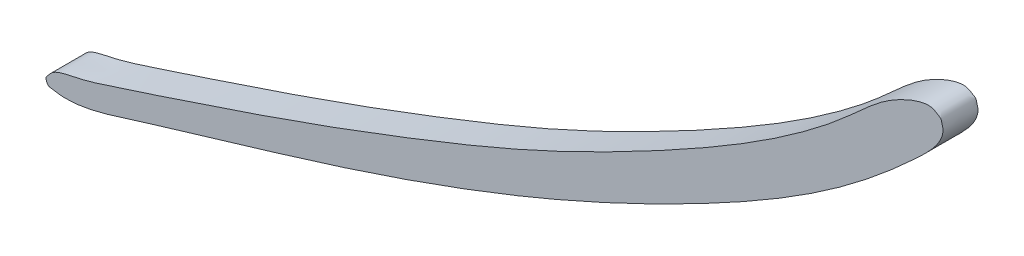
ISO-10303-21;
HEADER;
FILE_DESCRIPTION(('STEP AP214'),'2;1');
FILE_NAME('part.step','',(''),(''),'','','');
FILE_SCHEMA(('AUTOMOTIVE_DESIGN { 1 0 10303 214 1 1 1 1 }'));
ENDSEC;
DATA;
#1=APPLICATION_CONTEXT('core data for automotive mechanical design processes');
#2=APPLICATION_PROTOCOL_DEFINITION('international standard','automotive_design',2000,#1);
#3=PRODUCT_CONTEXT('',#1,'mechanical');
#4=PRODUCT('Part','Part','',(#3));
#5=PRODUCT_RELATED_PRODUCT_CATEGORY('part','',(#4));
#6=PRODUCT_DEFINITION_FORMATION('','',#4);
#7=PRODUCT_DEFINITION_CONTEXT('part definition',#1,'design');
#8=PRODUCT_DEFINITION('design','',#6,#7);
#9=PRODUCT_DEFINITION_SHAPE('','',#8);
#10=(LENGTH_UNIT() NAMED_UNIT(*) SI_UNIT(.MILLI.,.METRE.));
#11=(NAMED_UNIT(*) PLANE_ANGLE_UNIT() SI_UNIT($,.RADIAN.));
#12=(NAMED_UNIT(*) SI_UNIT($,.STERADIAN.) SOLID_ANGLE_UNIT());
#13=UNCERTAINTY_MEASURE_WITH_UNIT(LENGTH_MEASURE(1.E-05),#10,'distance_accuracy_value','');
#14=(GEOMETRIC_REPRESENTATION_CONTEXT(3) GLOBAL_UNCERTAINTY_ASSIGNED_CONTEXT((#13)) GLOBAL_UNIT_ASSIGNED_CONTEXT((#10,
#11,#12)) REPRESENTATION_CONTEXT('',''));
#15=CARTESIAN_POINT('',(0.,0.,0.));
#16=DIRECTION('',(0.,0.,1.));
#17=DIRECTION('',(1.,0.,0.));
#18=AXIS2_PLACEMENT_3D('',#15,#16,#17);
#19=CARTESIAN_POINT('',(101.278174761274,0.,164.));
#20=CARTESIAN_POINT('',(101.196611807845,0.13186931394045,164.));
#21=CARTESIAN_POINT('',(101.072466407993,0.224643944550873,164.));
#22=CARTESIAN_POINT('',(100.818565945272,0.395214220288657,164.));
#23=CARTESIAN_POINT('',(100.686543578852,0.472401149279883,164.));
#24=CARTESIAN_POINT('',(100.426362930768,0.632944433965708,164.));
#25=CARTESIAN_POINT('',(100.297634479578,0.715390452718156,164.));
#26=CARTESIAN_POINT('',(100.033903794659,0.870265721966218,164.));
#27=CARTESIAN_POINT('',(99.8993559470145,0.942916803534519,164.));
#28=CARTESIAN_POINT('',(99.6254353576749,1.07376517313045,164.));
#29=CARTESIAN_POINT('',(99.4856174166109,1.13169779454544,164.));
#30=CARTESIAN_POINT('',(99.1955989104292,1.22034410422208,164.));
#31=CARTESIAN_POINT('',(99.0444194431146,1.25209168169974,164.));
#32=CARTESIAN_POINT('',(98.5879754557925,1.31279358446028,164.));
#33=CARTESIAN_POINT('',(98.2843613202285,1.30831753406694,164.));
#34=CARTESIAN_POINT('',(97.6777965097938,1.2556339584156,164.));
#35=CARTESIAN_POINT('',(97.3744793383204,1.20594735266961,164.));
#36=CARTESIAN_POINT('',(96.7788856775683,1.08570169091296,164.));
#37=CARTESIAN_POINT('',(96.4848993358945,1.01389605244553,164.));
#38=CARTESIAN_POINT('',(95.6130694674906,0.767423543638094,164.));
#39=CARTESIAN_POINT('',(95.044443151236,0.564497070682965,164.));
#40=CARTESIAN_POINT('',(93.919150920644,0.121974005737695,164.));
#41=CARTESIAN_POINT('',(93.3617583737634,-0.121011476320135,164.));
#42=CARTESIAN_POINT('',(92.2673595765732,-0.639830667817924,164.));
#43=CARTESIAN_POINT('',(91.7307372745379,-0.914673392263955,164.));
#44=CARTESIAN_POINT('',(90.150529435972,-1.78247735530367,164.));
#45=CARTESIAN_POINT('',(89.1378841671863,-2.42058379336972,164.));
#46=CARTESIAN_POINT('',(86.2170336558303,-4.50574322574898,164.));
#47=CARTESIAN_POINT('',(84.4150847057242,-6.10798346029529,164.));
#48=CARTESIAN_POINT('',(81.7281867214623,-8.53412280786535,164.));
#49=CARTESIAN_POINT('',(80.8336850824739,-9.3444634949967,164.));
#50=CARTESIAN_POINT('',(79.02817022649,-10.941384270623,164.));
#51=CARTESIAN_POINT('',(78.1186309249775,-11.7300853625861,164.));
#52=CARTESIAN_POINT('',(75.3547056502068,-14.0453803963654,164.));
#53=CARTESIAN_POINT('',(73.4669744504147,-15.5239896728904,164.));
#54=CARTESIAN_POINT('',(69.6323568323243,-18.3960822977255,164.));
#55=CARTESIAN_POINT('',(67.6854942020713,-19.7895998776633,164.));
#56=CARTESIAN_POINT('',(63.7479241666334,-22.5135412436574,164.));
#57=CARTESIAN_POINT('',(61.7557712067038,-23.8418848380999,164.));
#58=CARTESIAN_POINT('',(57.7257896071502,-26.4328435125949,164.));
#59=CARTESIAN_POINT('',(55.6886841177962,-27.6964992250636,164.));
#60=CARTESIAN_POINT('',(51.5798184100099,-30.1739415758206,164.));
#61=CARTESIAN_POINT('',(49.5083162119315,-31.3880995122409,164.));
#62=CARTESIAN_POINT('',(45.3407776177159,-33.7811100234327,164.));
#63=CARTESIAN_POINT('',(43.2438648654855,-34.9597658724395,164.));
#64=CARTESIAN_POINT('',(36.924422148507,-38.4466613757849,164.));
#65=CARTESIAN_POINT('',(32.6752159295128,-40.7055268335579,164.));
#66=CARTESIAN_POINT('',(24.1213605227016,-45.112609571887,164.));
#67=CARTESIAN_POINT('',(19.8171065683248,-47.2605090621306,164.));
#68=CARTESIAN_POINT('',(11.135831427259,-51.4081389602946,164.));
#69=CARTESIAN_POINT('',(6.75573494709221,-53.4043805119669,164.));
#70=CARTESIAN_POINT('',(-2.06888960439692,-57.2382039481238,164.));
#71=CARTESIAN_POINT('',(-6.51387160351749,-59.0776823354614,164.));
#72=CARTESIAN_POINT('',(-15.4434151384645,-62.6628282345124,164.));
#73=CARTESIAN_POINT('',(-19.926244169031,-64.4117237709207,164.));
#74=CARTESIAN_POINT('',(-28.9124813953937,-67.8525832097907,164.));
#75=CARTESIAN_POINT('',(-33.4173433066344,-69.5422749724801,164.));
#76=CARTESIAN_POINT('',(-42.4553557897653,-72.8470309885117,164.));
#77=CARTESIAN_POINT('',(-46.9878439142653,-74.4609295085991,164.));
#78=CARTESIAN_POINT('',(-56.0779126718828,-77.6171084456401,164.));
#79=CARTESIAN_POINT('',(-60.6352005978237,-79.160458181162,164.));
#80=CARTESIAN_POINT('',(-69.7598956522185,-82.2169766430847,164.));
#81=CARTESIAN_POINT('',(-74.3266743966113,-83.7319960029322,164.));
#82=CARTESIAN_POINT('',(-81.1799698319193,-85.995013164245,164.));
#83=CARTESIAN_POINT('',(-83.4652954112106,-86.7466517405496,164.));
#84=CARTESIAN_POINT('',(-86.8968745676522,-87.8631101540163,164.));
#85=CARTESIAN_POINT('',(-88.041065650578,-88.2342324723788,164.));
#86=CARTESIAN_POINT('',(-90.3310455665826,-88.9715083774074,164.));
#87=CARTESIAN_POINT('',(-91.4782429255855,-89.3350921048735,164.));
#88=CARTESIAN_POINT('',(-93.7877967423607,-90.0027345821687,164.));
#89=CARTESIAN_POINT('',(-94.9503187192597,-90.3059988251538,164.));
#90=CARTESIAN_POINT('',(-96.7095494858666,-90.6999482276577,164.));
#91=CARTESIAN_POINT('',(-97.2995868202707,-90.8169546044106,164.));
#92=CARTESIAN_POINT('',(-98.4759188595069,-91.0657333364781,164.));
#93=CARTESIAN_POINT('',(-99.0611851569023,-91.1997371270738,164.));
#94=CARTESIAN_POINT('',(-100.208261835469,-91.5360754604389,164.));
#95=CARTESIAN_POINT('',(-100.771957271013,-91.7333202730694,164.));
#96=CARTESIAN_POINT('',(-101.432218296304,-92.1109093013032,164.));
#97=CARTESIAN_POINT('',(-101.562207175265,-92.1936417456148,164.));
#98=CARTESIAN_POINT('',(-101.808439941532,-92.3708284696113,164.));
#99=CARTESIAN_POINT('',(-101.925123839235,-92.4662940433738,164.));
#100=CARTESIAN_POINT('',(-102.259801648453,-92.7691156111485,164.));
#101=CARTESIAN_POINT('',(-102.463820143227,-92.9914023849305,164.));
#102=CARTESIAN_POINT('',(-102.754709358774,-93.3410059457333,164.));
#103=CARTESIAN_POINT('',(-102.852262442499,-93.4573877632831,164.));
#104=CARTESIAN_POINT('',(-103.036474174399,-93.6981103701269,164.));
#105=CARTESIAN_POINT('',(-103.127145808263,-93.8227457761735,164.));
#106=CARTESIAN_POINT('',(-103.210596798201,-94.0335270535309,164.));
#107=CARTESIAN_POINT('',(-103.227885265904,-94.1089993977839,164.));
#108=CARTESIAN_POINT('',(-103.234398813685,-94.2586320959487,164.));
#109=CARTESIAN_POINT('',(-103.225550827032,-94.3349698630311,164.));
#110=CARTESIAN_POINT('',(-103.177578170134,-94.555570855159,164.));
#111=CARTESIAN_POINT('',(-103.120697609588,-94.6943665734234,164.));
#112=CARTESIAN_POINT('',(-102.996451643543,-94.9684748467553,164.));
#113=CARTESIAN_POINT('',(-102.92905760982,-95.102758600488,164.));
#114=CARTESIAN_POINT('',(-102.795624236747,-95.2847701949518,164.));
#115=CARTESIAN_POINT('',(-102.744276828643,-95.3415284865059,164.));
#116=CARTESIAN_POINT('',(-102.628081009359,-95.4360199557578,164.));
#117=CARTESIAN_POINT('',(-102.561859248672,-95.4754600600116,164.));
#118=CARTESIAN_POINT('',(-102.352606948866,-95.5583360654393,164.));
#119=CARTESIAN_POINT('',(-102.199975238157,-95.5749744783614,164.));
#120=CARTESIAN_POINT('',(-101.899355797237,-95.6061832602794,164.));
#121=CARTESIAN_POINT('',(-101.748910655284,-95.6208018190503,164.));
#122=CARTESIAN_POINT('',(-101.299713583843,-95.6802319961183,164.));
#123=CARTESIAN_POINT('',(-101.001666873968,-95.730633150971,164.));
#124=CARTESIAN_POINT('',(-100.405129315416,-95.8262005599229,164.));
#125=CARTESIAN_POINT('',(-100.106806661241,-95.868542799422,164.));
#126=CARTESIAN_POINT('',(-99.2113880416712,-95.9500523185605,164.));
#127=CARTESIAN_POINT('',(-98.6139394940037,-95.9536081330314,164.));
#128=CARTESIAN_POINT('',(-96.8208402532593,-95.8881608033454,164.));
#129=CARTESIAN_POINT('',(-95.6205290670453,-95.752090895321,164.));
#130=CARTESIAN_POINT('',(-93.2604069109546,-95.3480764120028,164.));
#131=CARTESIAN_POINT('',(-92.0954694119324,-95.0783994068705,164.));
#132=CARTESIAN_POINT('',(-89.7794037715785,-94.4772560564484,164.));
#133=CARTESIAN_POINT('',(-88.6278281796122,-94.146487672298,164.));
#134=CARTESIAN_POINT('',(-85.1836472566121,-93.116248052865,164.));
#135=CARTESIAN_POINT('',(-82.8999233154662,-92.3888756297949,164.));
#136=CARTESIAN_POINT('',(-78.3251722413983,-90.9580177429241,164.));
#137=CARTESIAN_POINT('',(-76.0355134524054,-90.2498186162031,164.));
#138=CARTESIAN_POINT('',(-69.1565535010377,-88.1581877761038,164.));
#139=CARTESIAN_POINT('',(-64.5590753285306,-86.8018599396281,164.));
#140=CARTESIAN_POINT('',(-55.3686739116755,-84.0743221123157,164.));
#141=CARTESIAN_POINT('',(-50.7763054655863,-82.7014412654397,164.));
#142=CARTESIAN_POINT('',(-41.6124453177545,-79.8885150658556,164.));
#143=CARTESIAN_POINT('',(-37.0409962250183,-78.4483326317711,164.));
#144=CARTESIAN_POINT('',(-27.926595781695,-75.4762850406166,164.));
#145=CARTESIAN_POINT('',(-23.3841562030622,-73.9435444179661,164.));
#146=CARTESIAN_POINT('',(-14.339692815903,-70.7713915014889,164.));
#147=CARTESIAN_POINT('',(-9.83693004536124,-69.1317779937574,164.));
#148=CARTESIAN_POINT('',(-0.876191366635029,-65.7293928322584,164.));
#149=CARTESIAN_POINT('',(3.58276254816342,-63.9660064659851,164.));
#150=CARTESIAN_POINT('',(16.8713756248728,-58.4687874976129,164.));
#151=CARTESIAN_POINT('',(25.6160995295625,-54.5216087726302,164.));
#152=CARTESIAN_POINT('',(38.5432641440418,-48.2268448898704,164.));
#153=CARTESIAN_POINT('',(42.8155839669445,-46.0690258463445,164.));
#154=CARTESIAN_POINT('',(51.2782588030491,-41.6204850899157,164.));
#155=CARTESIAN_POINT('',(55.4685493784994,-39.3296588937684,164.));
#156=CARTESIAN_POINT('',(63.7316338621234,-34.5574903423925,164.));
#157=CARTESIAN_POINT('',(67.803252961178,-32.0742430810402,164.));
#158=CARTESIAN_POINT('',(73.7745419347511,-28.1286271365565,164.));
#159=CARTESIAN_POINT('',(75.7423620542375,-26.7767613571473,164.));
#160=CARTESIAN_POINT('',(79.6259654450552,-23.9886541247802,164.));
#161=CARTESIAN_POINT('',(81.5418670928573,-22.5526046145478,164.));
#162=CARTESIAN_POINT('',(85.319631451255,-19.5928836129997,164.));
#163=CARTESIAN_POINT('',(87.1809105576711,-18.0682658307868,164.));
#164=CARTESIAN_POINT('',(90.8521077991587,-14.9357505001002,164.));
#165=CARTESIAN_POINT('',(92.6598504157133,-13.3331954206633,164.));
#166=CARTESIAN_POINT('',(95.328327311143,-10.8842355465423,164.));
#167=CARTESIAN_POINT('',(96.210527941067,-10.0602407019361,164.));
#168=CARTESIAN_POINT('',(97.5062363595804,-8.79520605500653,164.));
#169=CARTESIAN_POINT('',(97.9325286638882,-8.36736814367718,164.));
#170=CARTESIAN_POINT('',(98.7641059423062,-7.49342435009831,164.));
#171=CARTESIAN_POINT('',(99.1707461053452,-7.04824060941403,164.));
#172=CARTESIAN_POINT('',(99.9427244250238,-6.12079967200792,164.));
#173=CARTESIAN_POINT('',(100.308787142155,-5.63687384755941,164.));
#174=CARTESIAN_POINT('',(100.954949199853,-4.6236742275265,164.));
#175=CARTESIAN_POINT('',(101.235050097085,-4.08999571632844,164.));
#176=CARTESIAN_POINT('',(101.551394168245,-3.23604652526543,164.));
#177=CARTESIAN_POINT('',(101.638230652332,-2.94732643231518,164.));
#178=CARTESIAN_POINT('',(101.721956094653,-2.50407029132432,164.));
#179=CARTESIAN_POINT('',(101.741958682091,-2.35458921743564,164.));
#180=CARTESIAN_POINT('',(101.760828733267,-2.05100479666709,164.));
#181=CARTESIAN_POINT('',(101.759638210253,-1.89652649367096,164.));
#182=CARTESIAN_POINT('',(101.711568032651,-1.44630210642924,164.));
#183=CARTESIAN_POINT('',(101.621432420505,-1.15746026935555,164.));
#184=CARTESIAN_POINT('',(101.493927991858,-0.722698804135184,164.));
#185=CARTESIAN_POINT('',(101.457853194145,-0.576132812227736,164.));
#186=CARTESIAN_POINT('',(101.388613050574,-0.281912743528655,164.));
#187=CARTESIAN_POINT('',(101.359737714703,-0.131869313940426,164.));
#188=CARTESIAN_POINT('',(101.278174761274,0.,164.));
#189=B_SPLINE_CURVE_WITH_KNOTS('',3,(#19,#20,#21,#22,#23,#24,#25,#26,#27,#28,#29,#30,#31,#32,
#33,#34,#35,#36,#37,#38,#39,#40,#41,#42,#43,#44,#45,#46,#47,#48,#49,#50,#51,#52,#53,#54,#55,#56,
#57,#58,#59,#60,#61,#62,#63,#64,#65,#66,#67,#68,#69,#70,#71,#72,#73,#74,#75,#76,#77,#78,#79,#80,
#81,#82,#83,#84,#85,#86,#87,#88,#89,#90,#91,#92,#93,#94,#95,#96,#97,#98,#99,#100,#101,#102,#103,
#104,#105,#106,#107,#108,#109,#110,#111,#112,#113,#114,#115,#116,#117,#118,#119,#120,#121,#122,
#123,#124,#125,#126,#127,#128,#129,#130,#131,#132,#133,#134,#135,#136,#137,#138,#139,#140,#141,
#142,#143,#144,#145,#146,#147,#148,#149,#150,#151,#152,#153,#154,#155,#156,#157,#158,#159,#160,
#161,#162,#163,#164,#165,#166,#167,#168,#169,#170,#171,#172,#173,#174,#175,#176,#177,#178,#179,
#180,#181,#182,#183,#184,#185,#186,#187,#188),.UNSPECIFIED.,.T.,.F.,(4,2,2,2,2,2,2,2,2,2,2,2,2,
2,2,2,2,2,2,2,2,2,2,2,2,2,2,2,2,2,2,2,2,2,2,2,2,2,2,2,2,2,2,2,2,2,2,2,2,2,2,2,2,2,2,2,2,2,2,2,2,
2,2,2,2,2,2,2,2,2,2,2,2,2,2,2,2,2,2,2,2,2,2,2,4),(0.,0.000976562500000054,0.00195312500000011,
0.00292968750000016,0.00390625000000022,0.00488281250000027,0.00585937500000033,
0.00781250000000035,0.00976562500000037,0.0117187500000004,0.0156250000000004,
0.0195312500000005,0.0234375000000005,0.0312500000000006,0.0468750000000008,0.0546875000000008,
0.0625000000000009,0.078125000000001,0.0937500000000011,0.109375000000001,0.125000000000001,
0.140625000000001,0.156250000000001,0.187500000000002,0.218750000000002,0.250000000000002,
0.281250000000002,0.312500000000002,0.343750000000002,0.375000000000003,0.406250000000003,
0.437500000000003,0.453125000000003,0.460937500000003,0.468750000000003,0.476562500000003,
0.480468750000003,0.484375000000003,0.488281250000003,0.489257812500003,0.490234375000003,
0.492187500000003,0.493164062500004,0.494140625000004,0.494628906250004,0.495117187500004,
0.496093750000004,0.497070312500004,0.497558593750004,0.498046875000004,0.499023437500004,
0.500000000000004,0.501953125000004,0.503906250000003,0.507812500000003,0.515625000000003,
0.523437500000003,0.531250000000003,0.546875000000003,0.562500000000003,0.593750000000003,
0.625000000000003,0.656250000000003,0.687500000000002,0.718750000000002,0.750000000000002,
0.812500000000002,0.843750000000001,0.875000000000001,0.906250000000001,0.921875000000001,
0.937500000000001,0.953125000000001,0.968750000000001,0.9765625,0.98046875,0.984375,0.98828125,
0.9921875,0.994140625,0.9951171875,0.99609375,0.998046875,0.9990234375,1.),.UNSPECIFIED.);
#190=DIRECTION('',(0.,0.,-1.));
#191=VECTOR('',#190,1.);
#192=SURFACE_OF_LINEAR_EXTRUSION('',#189,#191);
#193=CARTESIAN_POINT('',(101.278174761274,0.,164.));
#194=CARTESIAN_POINT('',(101.359737714703,-0.131869313940426,164.));
#195=CARTESIAN_POINT('',(101.388613050574,-0.281912743528655,164.));
#196=CARTESIAN_POINT('',(101.457853194145,-0.576132812227736,164.));
#197=CARTESIAN_POINT('',(101.493927991858,-0.722698804135184,164.));
#198=CARTESIAN_POINT('',(101.621432420505,-1.15746026935555,164.));
#199=CARTESIAN_POINT('',(101.711568032651,-1.44630210642924,164.));
#200=CARTESIAN_POINT('',(101.759638210253,-1.89652649367096,164.));
#201=CARTESIAN_POINT('',(101.760828733267,-2.05100479666709,164.));
#202=CARTESIAN_POINT('',(101.741958682091,-2.35458921743564,164.));
#203=CARTESIAN_POINT('',(101.721956094653,-2.50407029132432,164.));
#204=CARTESIAN_POINT('',(101.638230652332,-2.94732643231518,164.));
#205=CARTESIAN_POINT('',(101.551394168245,-3.23604652526543,164.));
#206=CARTESIAN_POINT('',(101.235050097085,-4.08999571632844,164.));
#207=CARTESIAN_POINT('',(100.954949199853,-4.6236742275265,164.));
#208=CARTESIAN_POINT('',(100.308787142155,-5.63687384755941,164.));
#209=CARTESIAN_POINT('',(99.9427244250238,-6.12079967200792,164.));
#210=CARTESIAN_POINT('',(99.1707461053452,-7.04824060941403,164.));
#211=CARTESIAN_POINT('',(98.7641059423062,-7.49342435009831,164.));
#212=CARTESIAN_POINT('',(97.9325286638882,-8.36736814367718,164.));
#213=CARTESIAN_POINT('',(97.5062363595804,-8.79520605500653,164.));
#214=CARTESIAN_POINT('',(96.210527941067,-10.0602407019361,164.));
#215=CARTESIAN_POINT('',(95.328327311143,-10.8842355465423,164.));
#216=CARTESIAN_POINT('',(92.6598504157133,-13.3331954206633,164.));
#217=CARTESIAN_POINT('',(90.8521077991587,-14.9357505001002,164.));
#218=CARTESIAN_POINT('',(87.1809105576711,-18.0682658307868,164.));
#219=CARTESIAN_POINT('',(85.319631451255,-19.5928836129997,164.));
#220=CARTESIAN_POINT('',(81.5418670928573,-22.5526046145478,164.));
#221=CARTESIAN_POINT('',(79.6259654450552,-23.9886541247802,164.));
#222=CARTESIAN_POINT('',(75.7423620542375,-26.7767613571473,164.));
#223=CARTESIAN_POINT('',(73.7745419347511,-28.1286271365565,164.));
#224=CARTESIAN_POINT('',(67.803252961178,-32.0742430810402,164.));
#225=CARTESIAN_POINT('',(63.7316338621234,-34.5574903423925,164.));
#226=CARTESIAN_POINT('',(55.4685493784994,-39.3296588937684,164.));
#227=CARTESIAN_POINT('',(51.2782588030491,-41.6204850899157,164.));
#228=CARTESIAN_POINT('',(42.8155839669445,-46.0690258463445,164.));
#229=CARTESIAN_POINT('',(38.5432641440418,-48.2268448898704,164.));
#230=CARTESIAN_POINT('',(25.6160995295625,-54.5216087726302,164.));
#231=CARTESIAN_POINT('',(16.8713756248728,-58.4687874976129,164.));
#232=CARTESIAN_POINT('',(3.58276254816342,-63.9660064659851,164.));
#233=CARTESIAN_POINT('',(-0.876191366635029,-65.7293928322584,164.));
#234=CARTESIAN_POINT('',(-9.83693004536124,-69.1317779937574,164.));
#235=CARTESIAN_POINT('',(-14.339692815903,-70.7713915014889,164.));
#236=CARTESIAN_POINT('',(-23.3841562030622,-73.9435444179661,164.));
#237=CARTESIAN_POINT('',(-27.926595781695,-75.4762850406166,164.));
#238=CARTESIAN_POINT('',(-37.0409962250183,-78.4483326317711,164.));
#239=CARTESIAN_POINT('',(-41.6124453177545,-79.8885150658556,164.));
#240=CARTESIAN_POINT('',(-50.7763054655863,-82.7014412654397,164.));
#241=CARTESIAN_POINT('',(-55.3686739116755,-84.0743221123157,164.));
#242=CARTESIAN_POINT('',(-64.5590753285306,-86.8018599396281,164.));
#243=CARTESIAN_POINT('',(-69.1565535010377,-88.1581877761038,164.));
#244=CARTESIAN_POINT('',(-76.0355134524054,-90.2498186162031,164.));
#245=CARTESIAN_POINT('',(-78.3251722413983,-90.9580177429241,164.));
#246=CARTESIAN_POINT('',(-82.8999233154662,-92.3888756297949,164.));
#247=CARTESIAN_POINT('',(-85.1836472566121,-93.116248052865,164.));
#248=CARTESIAN_POINT('',(-88.6278281796122,-94.146487672298,164.));
#249=CARTESIAN_POINT('',(-89.7794037715785,-94.4772560564484,164.));
#250=CARTESIAN_POINT('',(-92.0954694119324,-95.0783994068705,164.));
#251=CARTESIAN_POINT('',(-93.2604069109546,-95.3480764120028,164.));
#252=CARTESIAN_POINT('',(-95.6205290670453,-95.752090895321,164.));
#253=CARTESIAN_POINT('',(-96.8208402532593,-95.8881608033454,164.));
#254=CARTESIAN_POINT('',(-98.6139394940037,-95.9536081330314,164.));
#255=CARTESIAN_POINT('',(-99.2113880416712,-95.9500523185605,164.));
#256=CARTESIAN_POINT('',(-100.106806661241,-95.868542799422,164.));
#257=CARTESIAN_POINT('',(-100.405129315416,-95.8262005599229,164.));
#258=CARTESIAN_POINT('',(-101.001666873968,-95.730633150971,164.));
#259=CARTESIAN_POINT('',(-101.299713583843,-95.6802319961183,164.));
#260=CARTESIAN_POINT('',(-101.748910655284,-95.6208018190503,164.));
#261=CARTESIAN_POINT('',(-101.899355797237,-95.6061832602794,164.));
#262=CARTESIAN_POINT('',(-102.199975238157,-95.5749744783614,164.));
#263=CARTESIAN_POINT('',(-102.352606948866,-95.5583360654393,164.));
#264=CARTESIAN_POINT('',(-102.561859248672,-95.4754600600116,164.));
#265=CARTESIAN_POINT('',(-102.628081009359,-95.4360199557578,164.));
#266=CARTESIAN_POINT('',(-102.744276828643,-95.3415284865059,164.));
#267=CARTESIAN_POINT('',(-102.795624236747,-95.2847701949518,164.));
#268=CARTESIAN_POINT('',(-102.92905760982,-95.102758600488,164.));
#269=CARTESIAN_POINT('',(-102.996451643543,-94.9684748467553,164.));
#270=CARTESIAN_POINT('',(-103.120697609588,-94.6943665734234,164.));
#271=CARTESIAN_POINT('',(-103.177578170134,-94.555570855159,164.));
#272=CARTESIAN_POINT('',(-103.225550827032,-94.3349698630311,164.));
#273=CARTESIAN_POINT('',(-103.234398813685,-94.2586320959487,164.));
#274=CARTESIAN_POINT('',(-103.227885265904,-94.1089993977839,164.));
#275=CARTESIAN_POINT('',(-103.210596798201,-94.0335270535309,164.));
#276=CARTESIAN_POINT('',(-103.127145808263,-93.8227457761735,164.));
#277=CARTESIAN_POINT('',(-103.036474174399,-93.6981103701269,164.));
#278=CARTESIAN_POINT('',(-102.852262442499,-93.4573877632831,164.));
#279=CARTESIAN_POINT('',(-102.754709358774,-93.3410059457333,164.));
#280=CARTESIAN_POINT('',(-102.463820143227,-92.9914023849305,164.));
#281=CARTESIAN_POINT('',(-102.259801648453,-92.7691156111485,164.));
#282=CARTESIAN_POINT('',(-101.925123839235,-92.4662940433738,164.));
#283=CARTESIAN_POINT('',(-101.808439941532,-92.3708284696113,164.));
#284=CARTESIAN_POINT('',(-101.562207175265,-92.1936417456148,164.));
#285=CARTESIAN_POINT('',(-101.432218296304,-92.1109093013032,164.));
#286=CARTESIAN_POINT('',(-100.771957271013,-91.7333202730694,164.));
#287=CARTESIAN_POINT('',(-100.208261835469,-91.5360754604389,164.));
#288=CARTESIAN_POINT('',(-99.0611851569023,-91.1997371270738,164.));
#289=CARTESIAN_POINT('',(-98.4759188595069,-91.0657333364781,164.));
#290=CARTESIAN_POINT('',(-97.2995868202707,-90.8169546044106,164.));
#291=CARTESIAN_POINT('',(-96.7095494858666,-90.6999482276577,164.));
#292=CARTESIAN_POINT('',(-94.9503187192597,-90.3059988251538,164.));
#293=CARTESIAN_POINT('',(-93.7877967423607,-90.0027345821687,164.));
#294=CARTESIAN_POINT('',(-91.4782429255855,-89.3350921048735,164.));
#295=CARTESIAN_POINT('',(-90.3310455665826,-88.9715083774074,164.));
#296=CARTESIAN_POINT('',(-88.041065650578,-88.2342324723788,164.));
#297=CARTESIAN_POINT('',(-86.8968745676522,-87.8631101540163,164.));
#298=CARTESIAN_POINT('',(-83.4652954112106,-86.7466517405496,164.));
#299=CARTESIAN_POINT('',(-81.1799698319193,-85.995013164245,164.));
#300=CARTESIAN_POINT('',(-74.3266743966113,-83.7319960029322,164.));
#301=CARTESIAN_POINT('',(-69.7598956522185,-82.2169766430847,164.));
#302=CARTESIAN_POINT('',(-60.6352005978237,-79.160458181162,164.));
#303=CARTESIAN_POINT('',(-56.0779126718828,-77.6171084456401,164.));
#304=CARTESIAN_POINT('',(-46.9878439142653,-74.4609295085991,164.));
#305=CARTESIAN_POINT('',(-42.4553557897653,-72.8470309885117,164.));
#306=CARTESIAN_POINT('',(-33.4173433066344,-69.5422749724801,164.));
#307=CARTESIAN_POINT('',(-28.9124813953937,-67.8525832097907,164.));
#308=CARTESIAN_POINT('',(-19.926244169031,-64.4117237709207,164.));
#309=CARTESIAN_POINT('',(-15.4434151384645,-62.6628282345124,164.));
#310=CARTESIAN_POINT('',(-6.51387160351749,-59.0776823354614,164.));
#311=CARTESIAN_POINT('',(-2.06888960439692,-57.2382039481238,164.));
#312=CARTESIAN_POINT('',(6.75573494709221,-53.4043805119669,164.));
#313=CARTESIAN_POINT('',(11.135831427259,-51.4081389602946,164.));
#314=CARTESIAN_POINT('',(19.8171065683248,-47.2605090621306,164.));
#315=CARTESIAN_POINT('',(24.1213605227016,-45.112609571887,164.));
#316=CARTESIAN_POINT('',(32.6752159295128,-40.7055268335579,164.));
#317=CARTESIAN_POINT('',(36.924422148507,-38.4466613757849,164.));
#318=CARTESIAN_POINT('',(43.2438648654855,-34.9597658724395,164.));
#319=CARTESIAN_POINT('',(45.3407776177159,-33.7811100234327,164.));
#320=CARTESIAN_POINT('',(49.5083162119315,-31.3880995122409,164.));
#321=CARTESIAN_POINT('',(51.5798184100099,-30.1739415758206,164.));
#322=CARTESIAN_POINT('',(55.6886841177962,-27.6964992250636,164.));
#323=CARTESIAN_POINT('',(57.7257896071502,-26.4328435125949,164.));
#324=CARTESIAN_POINT('',(61.7557712067038,-23.8418848380999,164.));
#325=CARTESIAN_POINT('',(63.7479241666334,-22.5135412436574,164.));
#326=CARTESIAN_POINT('',(67.6854942020713,-19.7895998776633,164.));
#327=CARTESIAN_POINT('',(69.6323568323243,-18.3960822977255,164.));
#328=CARTESIAN_POINT('',(73.4669744504147,-15.5239896728904,164.));
#329=CARTESIAN_POINT('',(75.3547056502068,-14.0453803963654,164.));
#330=CARTESIAN_POINT('',(78.1186309249775,-11.7300853625861,164.));
#331=CARTESIAN_POINT('',(79.02817022649,-10.941384270623,164.));
#332=CARTESIAN_POINT('',(80.8336850824739,-9.3444634949967,164.));
#333=CARTESIAN_POINT('',(81.7281867214623,-8.53412280786535,164.));
#334=CARTESIAN_POINT('',(84.4150847057242,-6.10798346029529,164.));
#335=CARTESIAN_POINT('',(86.2170336558303,-4.50574322574898,164.));
#336=CARTESIAN_POINT('',(89.1378841671863,-2.42058379336972,164.));
#337=CARTESIAN_POINT('',(90.150529435972,-1.78247735530367,164.));
#338=CARTESIAN_POINT('',(91.7307372745379,-0.914673392263955,164.));
#339=CARTESIAN_POINT('',(92.2673595765732,-0.639830667817924,164.));
#340=CARTESIAN_POINT('',(93.3617583737634,-0.121011476320135,164.));
#341=CARTESIAN_POINT('',(93.919150920644,0.121974005737695,164.));
#342=CARTESIAN_POINT('',(95.044443151236,0.564497070682965,164.));
#343=CARTESIAN_POINT('',(95.6130694674906,0.767423543638094,164.));
#344=CARTESIAN_POINT('',(96.4848993358945,1.01389605244553,164.));
#345=CARTESIAN_POINT('',(96.7788856775683,1.08570169091296,164.));
#346=CARTESIAN_POINT('',(97.3744793383204,1.20594735266961,164.));
#347=CARTESIAN_POINT('',(97.6777965097938,1.2556339584156,164.));
#348=CARTESIAN_POINT('',(98.2843613202285,1.30831753406694,164.));
#349=CARTESIAN_POINT('',(98.5879754557925,1.31279358446028,164.));
#350=CARTESIAN_POINT('',(99.0444194431146,1.25209168169974,164.));
#351=CARTESIAN_POINT('',(99.1955989104292,1.22034410422208,164.));
#352=CARTESIAN_POINT('',(99.4856174166109,1.13169779454544,164.));
#353=CARTESIAN_POINT('',(99.6254353576749,1.07376517313045,164.));
#354=CARTESIAN_POINT('',(99.8993559470145,0.942916803534519,164.));
#355=CARTESIAN_POINT('',(100.033903794659,0.870265721966218,164.));
#356=CARTESIAN_POINT('',(100.297634479578,0.715390452718156,164.));
#357=CARTESIAN_POINT('',(100.426362930768,0.632944433965708,164.));
#358=CARTESIAN_POINT('',(100.686543578852,0.472401149279883,164.));
#359=CARTESIAN_POINT('',(100.818565945272,0.395214220288657,164.));
#360=CARTESIAN_POINT('',(101.072466407993,0.224643944550873,164.));
#361=CARTESIAN_POINT('',(101.196611807845,0.13186931394045,164.));
#362=CARTESIAN_POINT('',(101.278174761274,0.,164.));
#363=B_SPLINE_CURVE_WITH_KNOTS('',3,(#193,#194,#195,#196,#197,#198,#199,#200,#201,#202,#203,
#204,#205,#206,#207,#208,#209,#210,#211,#212,#213,#214,#215,#216,#217,#218,#219,#220,#221,#222,
#223,#224,#225,#226,#227,#228,#229,#230,#231,#232,#233,#234,#235,#236,#237,#238,#239,#240,#241,
#242,#243,#244,#245,#246,#247,#248,#249,#250,#251,#252,#253,#254,#255,#256,#257,#258,#259,#260,
#261,#262,#263,#264,#265,#266,#267,#268,#269,#270,#271,#272,#273,#274,#275,#276,#277,#278,#279,
#280,#281,#282,#283,#284,#285,#286,#287,#288,#289,#290,#291,#292,#293,#294,#295,#296,#297,#298,
#299,#300,#301,#302,#303,#304,#305,#306,#307,#308,#309,#310,#311,#312,#313,#314,#315,#316,#317,
#318,#319,#320,#321,#322,#323,#324,#325,#326,#327,#328,#329,#330,#331,#332,#333,#334,#335,#336,
#337,#338,#339,#340,#341,#342,#343,#344,#345,#346,#347,#348,#349,#350,#351,#352,#353,#354,#355,
#356,#357,#358,#359,#360,#361,#362),.UNSPECIFIED.,.T.,.F.,(4,2,2,2,2,2,2,2,2,2,2,2,2,2,2,2,2,2,
2,2,2,2,2,2,2,2,2,2,2,2,2,2,2,2,2,2,2,2,2,2,2,2,2,2,2,2,2,2,2,2,2,2,2,2,2,2,2,2,2,2,2,2,2,2,2,2,
2,2,2,2,2,2,2,2,2,2,2,2,2,2,2,2,2,2,4),(0.,0.0009765625,0.00195312500000011,0.00390625000000011,
0.0048828125,0.005859375,0.0078125,0.0117187499999999,0.0156249999999998,0.0195312499999997,
0.0234374999999996,0.0312499999999994,0.0468749999999992,0.0624999999999991,0.078124999999999,
0.0937499999999989,0.124999999999999,0.156249999999999,0.187499999999998,0.249999999999998,
0.281249999999998,0.312499999999998,0.343749999999997,0.374999999999997,0.406249999999997,
0.437499999999997,0.453124999999997,0.468749999999997,0.476562499999997,0.484374999999997,
0.492187499999997,0.496093749999997,0.498046874999996,0.499999999999996,0.500976562499996,
0.501953124999996,0.502441406249996,0.502929687499996,0.503906249999996,0.504882812499996,
0.505371093749996,0.505859374999996,0.506835937499996,0.507812499999996,0.509765624999997,
0.510742187499997,0.511718749999997,0.515624999999997,0.519531249999997,0.523437499999997,
0.531249999999997,0.539062499999997,0.546874999999997,0.562499999999997,0.593749999999997,
0.624999999999997,0.656249999999998,0.687499999999998,0.718749999999998,0.749999999999998,
0.781249999999998,0.812499999999998,0.843749999999999,0.859374999999999,0.874999999999999,
0.890624999999999,0.906249999999999,0.921874999999999,0.937499999999999,0.945312499999999,
0.953124999999999,0.968749999999999,0.976562499999999,0.98046875,0.984375,0.98828125,
0.990234375,0.9921875,0.994140625,0.9951171875,0.99609375,0.9970703125,0.998046875,0.9990234375,
1.),.UNSPECIFIED.);
#364=CARTESIAN_POINT('',(101.278174761274,0.,164.));
#365=VERTEX_POINT('',#364);
#366=EDGE_CURVE('E10',#365,#365,#363,.F.);
#367=ORIENTED_EDGE('',*,*,#366,.F.);
#368=EDGE_LOOP('',(#367));
#369=FACE_BOUND('',#368,.T.);
#370=CARTESIAN_POINT('',(101.278174761274,0.,156.));
#371=CARTESIAN_POINT('',(101.196611807845,0.13186931394045,156.));
#372=CARTESIAN_POINT('',(101.072466407993,0.224643944550873,156.));
#373=CARTESIAN_POINT('',(100.818565945272,0.395214220288657,156.));
#374=CARTESIAN_POINT('',(100.686543578852,0.472401149279883,156.));
#375=CARTESIAN_POINT('',(100.426362930768,0.632944433965708,156.));
#376=CARTESIAN_POINT('',(100.297634479578,0.715390452718156,156.));
#377=CARTESIAN_POINT('',(100.033903794659,0.870265721966218,156.));
#378=CARTESIAN_POINT('',(99.8993559470145,0.942916803534519,156.));
#379=CARTESIAN_POINT('',(99.6254353576749,1.07376517313045,156.));
#380=CARTESIAN_POINT('',(99.4856174166109,1.13169779454544,156.));
#381=CARTESIAN_POINT('',(99.1955989104292,1.22034410422208,156.));
#382=CARTESIAN_POINT('',(99.0444194431146,1.25209168169974,156.));
#383=CARTESIAN_POINT('',(98.5879754557925,1.31279358446028,156.));
#384=CARTESIAN_POINT('',(98.2843613202285,1.30831753406694,156.));
#385=CARTESIAN_POINT('',(97.6777965097938,1.2556339584156,156.));
#386=CARTESIAN_POINT('',(97.3744793383204,1.20594735266961,156.));
#387=CARTESIAN_POINT('',(96.7788856775683,1.08570169091296,156.));
#388=CARTESIAN_POINT('',(96.4848993358945,1.01389605244553,156.));
#389=CARTESIAN_POINT('',(95.6130694674906,0.767423543638094,156.));
#390=CARTESIAN_POINT('',(95.044443151236,0.564497070682965,156.));
#391=CARTESIAN_POINT('',(93.919150920644,0.121974005737695,156.));
#392=CARTESIAN_POINT('',(93.3617583737634,-0.121011476320135,156.));
#393=CARTESIAN_POINT('',(92.2673595765732,-0.639830667817924,156.));
#394=CARTESIAN_POINT('',(91.7307372745379,-0.914673392263955,156.));
#395=CARTESIAN_POINT('',(90.150529435972,-1.78247735530367,156.));
#396=CARTESIAN_POINT('',(89.1378841671863,-2.42058379336972,156.));
#397=CARTESIAN_POINT('',(86.2170336558303,-4.50574322574898,156.));
#398=CARTESIAN_POINT('',(84.4150847057242,-6.10798346029529,156.));
#399=CARTESIAN_POINT('',(81.7281867214623,-8.53412280786535,156.));
#400=CARTESIAN_POINT('',(80.8336850824739,-9.3444634949967,156.));
#401=CARTESIAN_POINT('',(79.02817022649,-10.941384270623,156.));
#402=CARTESIAN_POINT('',(78.1186309249775,-11.7300853625861,156.));
#403=CARTESIAN_POINT('',(75.3547056502068,-14.0453803963654,156.));
#404=CARTESIAN_POINT('',(73.4669744504147,-15.5239896728904,156.));
#405=CARTESIAN_POINT('',(69.6323568323243,-18.3960822977255,156.));
#406=CARTESIAN_POINT('',(67.6854942020713,-19.7895998776633,156.));
#407=CARTESIAN_POINT('',(63.7479241666334,-22.5135412436574,156.));
#408=CARTESIAN_POINT('',(61.7557712067038,-23.8418848380999,156.));
#409=CARTESIAN_POINT('',(57.7257896071502,-26.4328435125949,156.));
#410=CARTESIAN_POINT('',(55.6886841177962,-27.6964992250636,156.));
#411=CARTESIAN_POINT('',(51.5798184100099,-30.1739415758206,156.));
#412=CARTESIAN_POINT('',(49.5083162119315,-31.3880995122409,156.));
#413=CARTESIAN_POINT('',(45.3407776177159,-33.7811100234327,156.));
#414=CARTESIAN_POINT('',(43.2438648654855,-34.9597658724395,156.));
#415=CARTESIAN_POINT('',(36.924422148507,-38.4466613757849,156.));
#416=CARTESIAN_POINT('',(32.6752159295128,-40.7055268335579,156.));
#417=CARTESIAN_POINT('',(24.1213605227016,-45.112609571887,156.));
#418=CARTESIAN_POINT('',(19.8171065683248,-47.2605090621306,156.));
#419=CARTESIAN_POINT('',(11.135831427259,-51.4081389602946,156.));
#420=CARTESIAN_POINT('',(6.75573494709221,-53.4043805119669,156.));
#421=CARTESIAN_POINT('',(-2.06888960439692,-57.2382039481238,156.));
#422=CARTESIAN_POINT('',(-6.51387160351749,-59.0776823354614,156.));
#423=CARTESIAN_POINT('',(-15.4434151384645,-62.6628282345124,156.));
#424=CARTESIAN_POINT('',(-19.926244169031,-64.4117237709207,156.));
#425=CARTESIAN_POINT('',(-28.9124813953937,-67.8525832097907,156.));
#426=CARTESIAN_POINT('',(-33.4173433066344,-69.5422749724801,156.));
#427=CARTESIAN_POINT('',(-42.4553557897653,-72.8470309885117,156.));
#428=CARTESIAN_POINT('',(-46.9878439142653,-74.4609295085991,156.));
#429=CARTESIAN_POINT('',(-56.0779126718828,-77.6171084456401,156.));
#430=CARTESIAN_POINT('',(-60.6352005978237,-79.160458181162,156.));
#431=CARTESIAN_POINT('',(-69.7598956522185,-82.2169766430847,156.));
#432=CARTESIAN_POINT('',(-74.3266743966113,-83.7319960029322,156.));
#433=CARTESIAN_POINT('',(-81.1799698319193,-85.995013164245,156.));
#434=CARTESIAN_POINT('',(-83.4652954112106,-86.7466517405496,156.));
#435=CARTESIAN_POINT('',(-86.8968745676522,-87.8631101540163,156.));
#436=CARTESIAN_POINT('',(-88.041065650578,-88.2342324723788,156.));
#437=CARTESIAN_POINT('',(-90.3310455665826,-88.9715083774074,156.));
#438=CARTESIAN_POINT('',(-91.4782429255855,-89.3350921048735,156.));
#439=CARTESIAN_POINT('',(-93.7877967423607,-90.0027345821687,156.));
#440=CARTESIAN_POINT('',(-94.9503187192597,-90.3059988251538,156.));
#441=CARTESIAN_POINT('',(-96.7095494858666,-90.6999482276577,156.));
#442=CARTESIAN_POINT('',(-97.2995868202707,-90.8169546044106,156.));
#443=CARTESIAN_POINT('',(-98.4759188595069,-91.0657333364781,156.));
#444=CARTESIAN_POINT('',(-99.0611851569023,-91.1997371270738,156.));
#445=CARTESIAN_POINT('',(-100.208261835469,-91.5360754604389,156.));
#446=CARTESIAN_POINT('',(-100.771957271013,-91.7333202730694,156.));
#447=CARTESIAN_POINT('',(-101.432218296304,-92.1109093013032,156.));
#448=CARTESIAN_POINT('',(-101.562207175265,-92.1936417456148,156.));
#449=CARTESIAN_POINT('',(-101.808439941532,-92.3708284696113,156.));
#450=CARTESIAN_POINT('',(-101.925123839235,-92.4662940433738,156.));
#451=CARTESIAN_POINT('',(-102.259801648453,-92.7691156111485,156.));
#452=CARTESIAN_POINT('',(-102.463820143227,-92.9914023849305,156.));
#453=CARTESIAN_POINT('',(-102.754709358774,-93.3410059457333,156.));
#454=CARTESIAN_POINT('',(-102.852262442499,-93.4573877632831,156.));
#455=CARTESIAN_POINT('',(-103.036474174399,-93.6981103701269,156.));
#456=CARTESIAN_POINT('',(-103.127145808263,-93.8227457761735,156.));
#457=CARTESIAN_POINT('',(-103.210596798201,-94.0335270535309,156.));
#458=CARTESIAN_POINT('',(-103.227885265904,-94.1089993977839,156.));
#459=CARTESIAN_POINT('',(-103.234398813685,-94.2586320959487,156.));
#460=CARTESIAN_POINT('',(-103.225550827032,-94.3349698630311,156.));
#461=CARTESIAN_POINT('',(-103.177578170134,-94.555570855159,156.));
#462=CARTESIAN_POINT('',(-103.120697609588,-94.6943665734234,156.));
#463=CARTESIAN_POINT('',(-102.996451643543,-94.9684748467553,156.));
#464=CARTESIAN_POINT('',(-102.92905760982,-95.102758600488,156.));
#465=CARTESIAN_POINT('',(-102.795624236747,-95.2847701949518,156.));
#466=CARTESIAN_POINT('',(-102.744276828643,-95.3415284865059,156.));
#467=CARTESIAN_POINT('',(-102.628081009359,-95.4360199557578,156.));
#468=CARTESIAN_POINT('',(-102.561859248672,-95.4754600600116,156.));
#469=CARTESIAN_POINT('',(-102.352606948866,-95.5583360654393,156.));
#470=CARTESIAN_POINT('',(-102.199975238157,-95.5749744783614,156.));
#471=CARTESIAN_POINT('',(-101.899355797237,-95.6061832602794,156.));
#472=CARTESIAN_POINT('',(-101.748910655284,-95.6208018190503,156.));
#473=CARTESIAN_POINT('',(-101.299713583843,-95.6802319961183,156.));
#474=CARTESIAN_POINT('',(-101.001666873968,-95.730633150971,156.));
#475=CARTESIAN_POINT('',(-100.405129315416,-95.8262005599229,156.));
#476=CARTESIAN_POINT('',(-100.106806661241,-95.868542799422,156.));
#477=CARTESIAN_POINT('',(-99.2113880416712,-95.9500523185605,156.));
#478=CARTESIAN_POINT('',(-98.6139394940037,-95.9536081330314,156.));
#479=CARTESIAN_POINT('',(-96.8208402532593,-95.8881608033454,156.));
#480=CARTESIAN_POINT('',(-95.6205290670453,-95.752090895321,156.));
#481=CARTESIAN_POINT('',(-93.2604069109546,-95.3480764120028,156.));
#482=CARTESIAN_POINT('',(-92.0954694119324,-95.0783994068705,156.));
#483=CARTESIAN_POINT('',(-89.7794037715785,-94.4772560564484,156.));
#484=CARTESIAN_POINT('',(-88.6278281796122,-94.146487672298,156.));
#485=CARTESIAN_POINT('',(-85.1836472566121,-93.116248052865,156.));
#486=CARTESIAN_POINT('',(-82.8999233154662,-92.3888756297949,156.));
#487=CARTESIAN_POINT('',(-78.3251722413983,-90.9580177429241,156.));
#488=CARTESIAN_POINT('',(-76.0355134524054,-90.2498186162031,156.));
#489=CARTESIAN_POINT('',(-69.1565535010377,-88.1581877761038,156.));
#490=CARTESIAN_POINT('',(-64.5590753285306,-86.8018599396281,156.));
#491=CARTESIAN_POINT('',(-55.3686739116755,-84.0743221123157,156.));
#492=CARTESIAN_POINT('',(-50.7763054655863,-82.7014412654397,156.));
#493=CARTESIAN_POINT('',(-41.6124453177545,-79.8885150658556,156.));
#494=CARTESIAN_POINT('',(-37.0409962250183,-78.4483326317711,156.));
#495=CARTESIAN_POINT('',(-27.926595781695,-75.4762850406166,156.));
#496=CARTESIAN_POINT('',(-23.3841562030622,-73.9435444179661,156.));
#497=CARTESIAN_POINT('',(-14.339692815903,-70.7713915014889,156.));
#498=CARTESIAN_POINT('',(-9.83693004536124,-69.1317779937574,156.));
#499=CARTESIAN_POINT('',(-0.876191366635029,-65.7293928322584,156.));
#500=CARTESIAN_POINT('',(3.58276254816342,-63.9660064659851,156.));
#501=CARTESIAN_POINT('',(16.8713756248728,-58.4687874976129,156.));
#502=CARTESIAN_POINT('',(25.6160995295625,-54.5216087726302,156.));
#503=CARTESIAN_POINT('',(38.5432641440418,-48.2268448898704,156.));
#504=CARTESIAN_POINT('',(42.8155839669445,-46.0690258463445,156.));
#505=CARTESIAN_POINT('',(51.2782588030491,-41.6204850899157,156.));
#506=CARTESIAN_POINT('',(55.4685493784994,-39.3296588937684,156.));
#507=CARTESIAN_POINT('',(63.7316338621234,-34.5574903423925,156.));
#508=CARTESIAN_POINT('',(67.803252961178,-32.0742430810402,156.));
#509=CARTESIAN_POINT('',(73.7745419347511,-28.1286271365565,156.));
#510=CARTESIAN_POINT('',(75.7423620542375,-26.7767613571473,156.));
#511=CARTESIAN_POINT('',(79.6259654450552,-23.9886541247802,156.));
#512=CARTESIAN_POINT('',(81.5418670928573,-22.5526046145478,156.));
#513=CARTESIAN_POINT('',(85.319631451255,-19.5928836129997,156.));
#514=CARTESIAN_POINT('',(87.1809105576711,-18.0682658307868,156.));
#515=CARTESIAN_POINT('',(90.8521077991587,-14.9357505001002,156.));
#516=CARTESIAN_POINT('',(92.6598504157133,-13.3331954206633,156.));
#517=CARTESIAN_POINT('',(95.328327311143,-10.8842355465423,156.));
#518=CARTESIAN_POINT('',(96.210527941067,-10.0602407019361,156.));
#519=CARTESIAN_POINT('',(97.5062363595804,-8.79520605500653,156.));
#520=CARTESIAN_POINT('',(97.9325286638882,-8.36736814367718,156.));
#521=CARTESIAN_POINT('',(98.7641059423062,-7.49342435009831,156.));
#522=CARTESIAN_POINT('',(99.1707461053452,-7.04824060941403,156.));
#523=CARTESIAN_POINT('',(99.9427244250238,-6.12079967200792,156.));
#524=CARTESIAN_POINT('',(100.308787142155,-5.63687384755941,156.));
#525=CARTESIAN_POINT('',(100.954949199853,-4.6236742275265,156.));
#526=CARTESIAN_POINT('',(101.235050097085,-4.08999571632844,156.));
#527=CARTESIAN_POINT('',(101.551394168245,-3.23604652526543,156.));
#528=CARTESIAN_POINT('',(101.638230652332,-2.94732643231518,156.));
#529=CARTESIAN_POINT('',(101.721956094653,-2.50407029132432,156.));
#530=CARTESIAN_POINT('',(101.741958682091,-2.35458921743564,156.));
#531=CARTESIAN_POINT('',(101.760828733267,-2.05100479666709,156.));
#532=CARTESIAN_POINT('',(101.759638210253,-1.89652649367096,156.));
#533=CARTESIAN_POINT('',(101.711568032651,-1.44630210642924,156.));
#534=CARTESIAN_POINT('',(101.621432420505,-1.15746026935555,156.));
#535=CARTESIAN_POINT('',(101.493927991858,-0.722698804135184,156.));
#536=CARTESIAN_POINT('',(101.457853194145,-0.576132812227736,156.));
#537=CARTESIAN_POINT('',(101.388613050574,-0.281912743528655,156.));
#538=CARTESIAN_POINT('',(101.359737714703,-0.131869313940426,156.));
#539=CARTESIAN_POINT('',(101.278174761274,0.,156.));
#540=B_SPLINE_CURVE_WITH_KNOTS('',3,(#370,#371,#372,#373,#374,#375,#376,#377,#378,#379,#380,
#381,#382,#383,#384,#385,#386,#387,#388,#389,#390,#391,#392,#393,#394,#395,#396,#397,#398,#399,
#400,#401,#402,#403,#404,#405,#406,#407,#408,#409,#410,#411,#412,#413,#414,#415,#416,#417,#418,
#419,#420,#421,#422,#423,#424,#425,#426,#427,#428,#429,#430,#431,#432,#433,#434,#435,#436,#437,
#438,#439,#440,#441,#442,#443,#444,#445,#446,#447,#448,#449,#450,#451,#452,#453,#454,#455,#456,
#457,#458,#459,#460,#461,#462,#463,#464,#465,#466,#467,#468,#469,#470,#471,#472,#473,#474,#475,
#476,#477,#478,#479,#480,#481,#482,#483,#484,#485,#486,#487,#488,#489,#490,#491,#492,#493,#494,
#495,#496,#497,#498,#499,#500,#501,#502,#503,#504,#505,#506,#507,#508,#509,#510,#511,#512,#513,
#514,#515,#516,#517,#518,#519,#520,#521,#522,#523,#524,#525,#526,#527,#528,#529,#530,#531,#532,
#533,#534,#535,#536,#537,#538,#539),.UNSPECIFIED.,.T.,.F.,(4,2,2,2,2,2,2,2,2,2,2,2,2,2,2,2,2,2,
2,2,2,2,2,2,2,2,2,2,2,2,2,2,2,2,2,2,2,2,2,2,2,2,2,2,2,2,2,2,2,2,2,2,2,2,2,2,2,2,2,2,2,2,2,2,2,2,
2,2,2,2,2,2,2,2,2,2,2,2,2,2,2,2,2,2,4),(0.,0.000976562500000054,0.00195312500000011,
0.00292968750000016,0.00390625000000022,0.00488281250000027,0.00585937500000033,
0.00781250000000035,0.00976562500000037,0.0117187500000004,0.0156250000000004,
0.0195312500000005,0.0234375000000005,0.0312500000000006,0.0468750000000008,0.0546875000000008,
0.0625000000000009,0.078125000000001,0.0937500000000011,0.109375000000001,0.125000000000001,
0.140625000000001,0.156250000000001,0.187500000000002,0.218750000000002,0.250000000000002,
0.281250000000002,0.312500000000002,0.343750000000002,0.375000000000003,0.406250000000003,
0.437500000000003,0.453125000000003,0.460937500000003,0.468750000000003,0.476562500000003,
0.480468750000003,0.484375000000003,0.488281250000003,0.489257812500003,0.490234375000003,
0.492187500000003,0.493164062500004,0.494140625000004,0.494628906250004,0.495117187500004,
0.496093750000004,0.497070312500004,0.497558593750004,0.498046875000004,0.499023437500004,
0.500000000000004,0.501953125000004,0.503906250000003,0.507812500000003,0.515625000000003,
0.523437500000003,0.531250000000003,0.546875000000003,0.562500000000003,0.593750000000003,
0.625000000000003,0.656250000000003,0.687500000000002,0.718750000000002,0.750000000000002,
0.812500000000002,0.843750000000001,0.875000000000001,0.906250000000001,0.921875000000001,
0.937500000000001,0.953125000000001,0.968750000000001,0.9765625,0.98046875,0.984375,0.98828125,
0.9921875,0.994140625,0.9951171875,0.99609375,0.998046875,0.9990234375,1.),.UNSPECIFIED.);
#541=CARTESIAN_POINT('',(101.278174761274,0.,156.));
#542=VERTEX_POINT('',#541);
#543=EDGE_CURVE('E38',#542,#542,#540,.T.);
#544=ORIENTED_EDGE('',*,*,#543,.T.);
#545=EDGE_LOOP('',(#544));
#546=FACE_BOUND('',#545,.T.);
#547=ADVANCED_FACE('F28',(#369,#546),#192,.F.);
#548=CARTESIAN_POINT('',(-101.599178298139,-95.6406118780728,164.));
#549=DIRECTION('',(0.,0.,-1.));
#550=DIRECTION('',(-1.,0.,0.));
#551=AXIS2_PLACEMENT_3D('',#548,#549,#550);
#552=PLANE('',#551);
#553=ORIENTED_EDGE('',*,*,#366,.T.);
#554=EDGE_LOOP('',(#553));
#555=FACE_BOUND('',#554,.T.);
#556=ADVANCED_FACE('F69',(#555),#552,.F.);
#557=CARTESIAN_POINT('',(-101.599178298139,-95.6406118780728,156.));
#558=DIRECTION('',(0.,0.,-1.));
#559=DIRECTION('',(-1.,0.,0.));
#560=AXIS2_PLACEMENT_3D('',#557,#558,#559);
#561=PLANE('',#560);
#562=ORIENTED_EDGE('',*,*,#543,.F.);
#563=EDGE_LOOP('',(#562));
#564=FACE_BOUND('',#563,.T.);
#565=ADVANCED_FACE('F77',(#564),#561,.T.);
#566=CLOSED_SHELL('',(#547,#556,#565));
#567=MANIFOLD_SOLID_BREP('B2',#566);
#568=ADVANCED_BREP_SHAPE_REPRESENTATION('',(#18,#567),#14);
#569=SHAPE_DEFINITION_REPRESENTATION(#9,#568);
ENDSEC;
END-ISO-10303-21;
